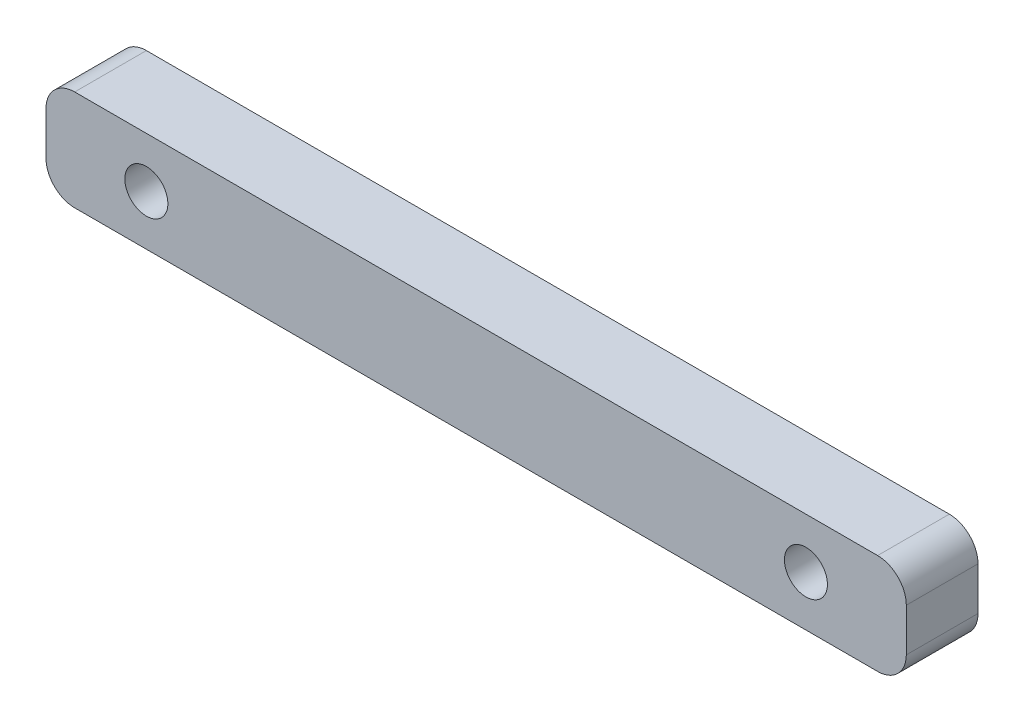
ISO-10303-21;
HEADER;
FILE_DESCRIPTION(('STEP AP214'),'2;1');
FILE_NAME('part.step','',(''),(''),'','','');
FILE_SCHEMA(('AUTOMOTIVE_DESIGN { 1 0 10303 214 1 1 1 1 }'));
ENDSEC;
DATA;
#1=APPLICATION_CONTEXT('core data for automotive mechanical design processes');
#2=APPLICATION_PROTOCOL_DEFINITION('international standard','automotive_design',2000,#1);
#3=PRODUCT_CONTEXT('',#1,'mechanical');
#4=PRODUCT('Part','Part','',(#3));
#5=PRODUCT_RELATED_PRODUCT_CATEGORY('part','',(#4));
#6=PRODUCT_DEFINITION_FORMATION('','',#4);
#7=PRODUCT_DEFINITION_CONTEXT('part definition',#1,'design');
#8=PRODUCT_DEFINITION('design','',#6,#7);
#9=PRODUCT_DEFINITION_SHAPE('','',#8);
#10=(LENGTH_UNIT() NAMED_UNIT(*) SI_UNIT(.MILLI.,.METRE.));
#11=(NAMED_UNIT(*) PLANE_ANGLE_UNIT() SI_UNIT($,.RADIAN.));
#12=(NAMED_UNIT(*) SI_UNIT($,.STERADIAN.) SOLID_ANGLE_UNIT());
#13=UNCERTAINTY_MEASURE_WITH_UNIT(LENGTH_MEASURE(1.E-05),#10,'distance_accuracy_value','');
#14=(GEOMETRIC_REPRESENTATION_CONTEXT(3) GLOBAL_UNCERTAINTY_ASSIGNED_CONTEXT((#13)) GLOBAL_UNIT_ASSIGNED_CONTEXT((#10,
#11,#12)) REPRESENTATION_CONTEXT('',''));
#15=CARTESIAN_POINT('',(0.,0.,0.));
#16=DIRECTION('',(0.,0.,1.));
#17=DIRECTION('',(1.,0.,0.));
#18=AXIS2_PLACEMENT_3D('',#15,#16,#17);
#19=CARTESIAN_POINT('',(0.,0.,5.));
#20=DIRECTION('',(0.,0.,-1.));
#21=DIRECTION('',(-1.,0.,0.));
#22=AXIS2_PLACEMENT_3D('',#19,#20,#21);
#23=PLANE('',#22);
#24=DIRECTION('',(0.,1.,0.));
#25=VECTOR('',#24,1.);
#26=CARTESIAN_POINT('',(30.,-3.5,5.));
#27=LINE('',#26,#25);
#28=CARTESIAN_POINT('',(30.,-1.5,5.));
#29=VERTEX_POINT('',#28);
#30=CARTESIAN_POINT('',(30.,1.5,5.));
#31=VERTEX_POINT('',#30);
#32=EDGE_CURVE('E145',#29,#31,#27,.T.);
#33=ORIENTED_EDGE('',*,*,#32,.T.);
#34=CARTESIAN_POINT('',(28.,1.5,5.));
#35=DIRECTION('',(0.,0.,-1.));
#36=DIRECTION('',(-1.,0.,0.));
#37=AXIS2_PLACEMENT_3D('',#34,#35,#36);
#38=CIRCLE('',#37,2.);
#39=CARTESIAN_POINT('',(28.,3.5,5.));
#40=VERTEX_POINT('',#39);
#41=EDGE_CURVE('E159',#31,#40,#38,.F.);
#42=ORIENTED_EDGE('',*,*,#41,.T.);
#43=DIRECTION('',(-1.,0.,0.));
#44=VECTOR('',#43,1.);
#45=CARTESIAN_POINT('',(-30.,3.5,5.));
#46=LINE('',#45,#44);
#47=CARTESIAN_POINT('',(-28.,3.5,5.));
#48=VERTEX_POINT('',#47);
#49=EDGE_CURVE('E126',#40,#48,#46,.T.);
#50=ORIENTED_EDGE('',*,*,#49,.T.);
#51=CARTESIAN_POINT('',(-28.,1.5,5.));
#52=DIRECTION('',(0.,0.,-1.));
#53=DIRECTION('',(-1.,0.,0.));
#54=AXIS2_PLACEMENT_3D('',#51,#52,#53);
#55=CIRCLE('',#54,2.);
#56=CARTESIAN_POINT('',(-30.,1.5,5.));
#57=VERTEX_POINT('',#56);
#58=EDGE_CURVE('E155',#48,#57,#55,.F.);
#59=ORIENTED_EDGE('',*,*,#58,.T.);
#60=DIRECTION('',(0.,-1.,0.));
#61=VECTOR('',#60,1.);
#62=CARTESIAN_POINT('',(-30.,-3.5,5.));
#63=LINE('',#62,#61);
#64=CARTESIAN_POINT('',(-30.,-1.5,5.));
#65=VERTEX_POINT('',#64);
#66=EDGE_CURVE('E168',#57,#65,#63,.T.);
#67=ORIENTED_EDGE('',*,*,#66,.T.);
#68=CARTESIAN_POINT('',(-28.,-1.5,5.));
#69=DIRECTION('',(0.,0.,-1.));
#70=DIRECTION('',(-1.,0.,0.));
#71=AXIS2_PLACEMENT_3D('',#68,#69,#70);
#72=CIRCLE('',#71,2.);
#73=CARTESIAN_POINT('',(-28.,-3.5,5.));
#74=VERTEX_POINT('',#73);
#75=EDGE_CURVE('E61',#65,#74,#72,.F.);
#76=ORIENTED_EDGE('',*,*,#75,.T.);
#77=DIRECTION('',(1.,0.,0.));
#78=VECTOR('',#77,1.);
#79=CARTESIAN_POINT('',(-30.,-3.5,5.));
#80=LINE('',#79,#78);
#81=CARTESIAN_POINT('',(28.,-3.5,5.));
#82=VERTEX_POINT('',#81);
#83=EDGE_CURVE('E146',#74,#82,#80,.T.);
#84=ORIENTED_EDGE('',*,*,#83,.T.);
#85=CARTESIAN_POINT('',(28.,-1.5,5.));
#86=DIRECTION('',(0.,0.,-1.));
#87=DIRECTION('',(-1.,0.,0.));
#88=AXIS2_PLACEMENT_3D('',#85,#86,#87);
#89=CIRCLE('',#88,2.);
#90=EDGE_CURVE('E157',#82,#29,#89,.F.);
#91=ORIENTED_EDGE('',*,*,#90,.T.);
#92=EDGE_LOOP('',(#33,#42,#50,#59,#67,#76,#84,#91));
#93=FACE_BOUND('',#92,.T.);
#94=CARTESIAN_POINT('',(-23.,0.,5.));
#95=DIRECTION('',(0.,0.,1.));
#96=DIRECTION('',(1.,0.,0.));
#97=AXIS2_PLACEMENT_3D('',#94,#95,#96);
#98=CIRCLE('',#97,1.5);
#99=CARTESIAN_POINT('',(-21.5,0.,5.));
#100=VERTEX_POINT('',#99);
#101=EDGE_CURVE('E140',#100,#100,#98,.T.);
#102=ORIENTED_EDGE('',*,*,#101,.F.);
#103=EDGE_LOOP('',(#102));
#104=FACE_BOUND('',#103,.T.);
#105=CARTESIAN_POINT('',(23.,0.,5.));
#106=DIRECTION('',(0.,0.,1.));
#107=DIRECTION('',(-1.,0.,0.));
#108=AXIS2_PLACEMENT_3D('',#105,#106,#107);
#109=CIRCLE('',#108,1.5);
#110=CARTESIAN_POINT('',(21.5,0.,5.));
#111=VERTEX_POINT('',#110);
#112=EDGE_CURVE('E191',#111,#111,#109,.T.);
#113=ORIENTED_EDGE('',*,*,#112,.F.);
#114=EDGE_LOOP('',(#113));
#115=FACE_BOUND('',#114,.T.);
#116=ADVANCED_FACE('F39',(#93,#104,#115),#23,.F.);
#117=CARTESIAN_POINT('',(0.,0.,0.));
#118=DIRECTION('',(0.,0.,-1.));
#119=DIRECTION('',(-1.,0.,0.));
#120=AXIS2_PLACEMENT_3D('',#117,#118,#119);
#121=PLANE('',#120);
#122=CARTESIAN_POINT('',(-23.,0.,0.));
#123=DIRECTION('',(0.,0.,1.));
#124=DIRECTION('',(1.,0.,0.));
#125=AXIS2_PLACEMENT_3D('',#122,#123,#124);
#126=CIRCLE('',#125,1.5);
#127=CARTESIAN_POINT('',(-21.5,0.,0.));
#128=VERTEX_POINT('',#127);
#129=EDGE_CURVE('E188',#128,#128,#126,.T.);
#130=ORIENTED_EDGE('',*,*,#129,.T.);
#131=EDGE_LOOP('',(#130));
#132=FACE_BOUND('',#131,.T.);
#133=DIRECTION('',(-1.,0.,0.));
#134=VECTOR('',#133,1.);
#135=CARTESIAN_POINT('',(-30.,3.5,0.));
#136=LINE('',#135,#134);
#137=CARTESIAN_POINT('',(28.,3.5,0.));
#138=VERTEX_POINT('',#137);
#139=CARTESIAN_POINT('',(-28.,3.5,0.));
#140=VERTEX_POINT('',#139);
#141=EDGE_CURVE('E123',#138,#140,#136,.T.);
#142=ORIENTED_EDGE('',*,*,#141,.F.);
#143=CARTESIAN_POINT('',(28.,1.5,0.));
#144=DIRECTION('',(0.,0.,-1.));
#145=DIRECTION('',(-1.,0.,0.));
#146=AXIS2_PLACEMENT_3D('',#143,#144,#145);
#147=CIRCLE('',#146,2.);
#148=CARTESIAN_POINT('',(30.,1.5,0.));
#149=VERTEX_POINT('',#148);
#150=EDGE_CURVE('E106',#138,#149,#147,.T.);
#151=ORIENTED_EDGE('',*,*,#150,.T.);
#152=DIRECTION('',(0.,1.,0.));
#153=VECTOR('',#152,1.);
#154=CARTESIAN_POINT('',(30.,-3.5,0.));
#155=LINE('',#154,#153);
#156=CARTESIAN_POINT('',(30.,-1.5,0.));
#157=VERTEX_POINT('',#156);
#158=EDGE_CURVE('E135',#157,#149,#155,.T.);
#159=ORIENTED_EDGE('',*,*,#158,.F.);
#160=CARTESIAN_POINT('',(28.,-1.5,0.));
#161=DIRECTION('',(0.,0.,-1.));
#162=DIRECTION('',(-1.,0.,0.));
#163=AXIS2_PLACEMENT_3D('',#160,#161,#162);
#164=CIRCLE('',#163,2.);
#165=CARTESIAN_POINT('',(28.,-3.5,0.));
#166=VERTEX_POINT('',#165);
#167=EDGE_CURVE('E117',#157,#166,#164,.T.);
#168=ORIENTED_EDGE('',*,*,#167,.T.);
#169=DIRECTION('',(1.,0.,0.));
#170=VECTOR('',#169,1.);
#171=CARTESIAN_POINT('',(-30.,-3.5,0.));
#172=LINE('',#171,#170);
#173=CARTESIAN_POINT('',(-28.,-3.5,0.));
#174=VERTEX_POINT('',#173);
#175=EDGE_CURVE('E138',#174,#166,#172,.T.);
#176=ORIENTED_EDGE('',*,*,#175,.F.);
#177=CARTESIAN_POINT('',(-28.,-1.5,0.));
#178=DIRECTION('',(0.,0.,-1.));
#179=DIRECTION('',(-1.,0.,0.));
#180=AXIS2_PLACEMENT_3D('',#177,#178,#179);
#181=CIRCLE('',#180,2.);
#182=CARTESIAN_POINT('',(-30.,-1.5,0.));
#183=VERTEX_POINT('',#182);
#184=EDGE_CURVE('E127',#174,#183,#181,.T.);
#185=ORIENTED_EDGE('',*,*,#184,.T.);
#186=DIRECTION('',(0.,-1.,0.));
#187=VECTOR('',#186,1.);
#188=CARTESIAN_POINT('',(-30.,-3.5,0.));
#189=LINE('',#188,#187);
#190=CARTESIAN_POINT('',(-30.,1.5,0.));
#191=VERTEX_POINT('',#190);
#192=EDGE_CURVE('E134',#191,#183,#189,.T.);
#193=ORIENTED_EDGE('',*,*,#192,.F.);
#194=CARTESIAN_POINT('',(-28.,1.5,0.));
#195=DIRECTION('',(0.,0.,-1.));
#196=DIRECTION('',(-1.,0.,0.));
#197=AXIS2_PLACEMENT_3D('',#194,#195,#196);
#198=CIRCLE('',#197,2.);
#199=EDGE_CURVE('E133',#191,#140,#198,.T.);
#200=ORIENTED_EDGE('',*,*,#199,.T.);
#201=EDGE_LOOP('',(#142,#151,#159,#168,#176,#185,#193,#200));
#202=FACE_BOUND('',#201,.T.);
#203=CARTESIAN_POINT('',(23.,0.,0.));
#204=DIRECTION('',(0.,0.,1.));
#205=DIRECTION('',(-1.,0.,0.));
#206=AXIS2_PLACEMENT_3D('',#203,#204,#205);
#207=CIRCLE('',#206,1.5);
#208=CARTESIAN_POINT('',(21.5,0.,0.));
#209=VERTEX_POINT('',#208);
#210=EDGE_CURVE('E194',#209,#209,#207,.T.);
#211=ORIENTED_EDGE('',*,*,#210,.T.);
#212=EDGE_LOOP('',(#211));
#213=FACE_BOUND('',#212,.T.);
#214=ADVANCED_FACE('F130',(#132,#202,#213),#121,.T.);
#215=CARTESIAN_POINT('',(30.,-3.5,5.));
#216=DIRECTION('',(-1.,0.,0.));
#217=DIRECTION('',(0.,0.,1.));
#218=AXIS2_PLACEMENT_3D('',#215,#216,#217);
#219=PLANE('',#218);
#220=ORIENTED_EDGE('',*,*,#158,.T.);
#221=DIRECTION('',(0.,0.,-1.));
#222=VECTOR('',#221,1.);
#223=CARTESIAN_POINT('',(30.,1.5,5.));
#224=LINE('',#223,#222);
#225=EDGE_CURVE('E111',#149,#31,#224,.F.);
#226=ORIENTED_EDGE('',*,*,#225,.T.);
#227=ORIENTED_EDGE('',*,*,#32,.F.);
#228=DIRECTION('',(0.,0.,-1.));
#229=VECTOR('',#228,1.);
#230=CARTESIAN_POINT('',(30.,-1.5,5.));
#231=LINE('',#230,#229);
#232=EDGE_CURVE('E116',#29,#157,#231,.T.);
#233=ORIENTED_EDGE('',*,*,#232,.T.);
#234=EDGE_LOOP('',(#220,#226,#227,#233));
#235=FACE_BOUND('',#234,.T.);
#236=ADVANCED_FACE('F184',(#235),#219,.F.);
#237=CARTESIAN_POINT('',(-30.,3.5,5.));
#238=DIRECTION('',(0.,-1.,0.));
#239=DIRECTION('',(0.,0.,-1.));
#240=AXIS2_PLACEMENT_3D('',#237,#238,#239);
#241=PLANE('',#240);
#242=ORIENTED_EDGE('',*,*,#49,.F.);
#243=DIRECTION('',(0.,0.,-1.));
#244=VECTOR('',#243,1.);
#245=CARTESIAN_POINT('',(28.,3.5,5.));
#246=LINE('',#245,#244);
#247=EDGE_CURVE('E110',#40,#138,#246,.T.);
#248=ORIENTED_EDGE('',*,*,#247,.T.);
#249=ORIENTED_EDGE('',*,*,#141,.T.);
#250=DIRECTION('',(0.,0.,-1.));
#251=VECTOR('',#250,1.);
#252=CARTESIAN_POINT('',(-28.,3.5,5.));
#253=LINE('',#252,#251);
#254=EDGE_CURVE('E128',#140,#48,#253,.F.);
#255=ORIENTED_EDGE('',*,*,#254,.T.);
#256=EDGE_LOOP('',(#242,#248,#249,#255));
#257=FACE_BOUND('',#256,.T.);
#258=ADVANCED_FACE('F122',(#257),#241,.F.);
#259=CARTESIAN_POINT('',(-30.,-3.5,5.));
#260=DIRECTION('',(1.,0.,0.));
#261=DIRECTION('',(0.,0.,-1.));
#262=AXIS2_PLACEMENT_3D('',#259,#260,#261);
#263=PLANE('',#262);
#264=ORIENTED_EDGE('',*,*,#66,.F.);
#265=DIRECTION('',(0.,0.,-1.));
#266=VECTOR('',#265,1.);
#267=CARTESIAN_POINT('',(-30.,1.5,5.));
#268=LINE('',#267,#266);
#269=EDGE_CURVE('E11',#57,#191,#268,.T.);
#270=ORIENTED_EDGE('',*,*,#269,.T.);
#271=ORIENTED_EDGE('',*,*,#192,.T.);
#272=DIRECTION('',(0.,0.,-1.));
#273=VECTOR('',#272,1.);
#274=CARTESIAN_POINT('',(-30.,-1.5,5.));
#275=LINE('',#274,#273);
#276=EDGE_CURVE('E47',#183,#65,#275,.F.);
#277=ORIENTED_EDGE('',*,*,#276,.T.);
#278=EDGE_LOOP('',(#264,#270,#271,#277));
#279=FACE_BOUND('',#278,.T.);
#280=ADVANCED_FACE('F167',(#279),#263,.F.);
#281=CARTESIAN_POINT('',(-30.,-3.5,5.));
#282=DIRECTION('',(0.,1.,0.));
#283=DIRECTION('',(0.,0.,1.));
#284=AXIS2_PLACEMENT_3D('',#281,#282,#283);
#285=PLANE('',#284);
#286=ORIENTED_EDGE('',*,*,#175,.T.);
#287=DIRECTION('',(0.,0.,-1.));
#288=VECTOR('',#287,1.);
#289=CARTESIAN_POINT('',(28.,-3.5,5.));
#290=LINE('',#289,#288);
#291=EDGE_CURVE('E54',#166,#82,#290,.F.);
#292=ORIENTED_EDGE('',*,*,#291,.T.);
#293=ORIENTED_EDGE('',*,*,#83,.F.);
#294=DIRECTION('',(0.,0.,-1.));
#295=VECTOR('',#294,1.);
#296=CARTESIAN_POINT('',(-28.,-3.5,5.));
#297=LINE('',#296,#295);
#298=EDGE_CURVE('E161',#74,#174,#297,.T.);
#299=ORIENTED_EDGE('',*,*,#298,.T.);
#300=EDGE_LOOP('',(#286,#292,#293,#299));
#301=FACE_BOUND('',#300,.T.);
#302=ADVANCED_FACE('F177',(#301),#285,.F.);
#303=CARTESIAN_POINT('',(-23.,0.,5.));
#304=DIRECTION('',(0.,0.,-1.));
#305=DIRECTION('',(-1.,0.,0.));
#306=AXIS2_PLACEMENT_3D('',#303,#304,#305);
#307=CYLINDRICAL_SURFACE('',#306,1.5);
#308=ORIENTED_EDGE('',*,*,#101,.T.);
#309=EDGE_LOOP('',(#308));
#310=FACE_BOUND('',#309,.T.);
#311=ORIENTED_EDGE('',*,*,#129,.F.);
#312=EDGE_LOOP('',(#311));
#313=FACE_BOUND('',#312,.T.);
#314=ADVANCED_FACE('F212',(#310,#313),#307,.F.);
#315=CARTESIAN_POINT('',(23.,0.,5.));
#316=DIRECTION('',(0.,0.,-1.));
#317=DIRECTION('',(-1.,0.,0.));
#318=AXIS2_PLACEMENT_3D('',#315,#316,#317);
#319=CYLINDRICAL_SURFACE('',#318,1.5);
#320=ORIENTED_EDGE('',*,*,#112,.T.);
#321=EDGE_LOOP('',(#320));
#322=FACE_BOUND('',#321,.T.);
#323=ORIENTED_EDGE('',*,*,#210,.F.);
#324=EDGE_LOOP('',(#323));
#325=FACE_BOUND('',#324,.T.);
#326=ADVANCED_FACE('F200',(#322,#325),#319,.F.);
#327=CARTESIAN_POINT('',(28.,1.5,5.));
#328=DIRECTION('',(0.,0.,-1.));
#329=DIRECTION('',(-1.,0.,0.));
#330=AXIS2_PLACEMENT_3D('',#327,#328,#329);
#331=CYLINDRICAL_SURFACE('',#330,2.);
#332=ORIENTED_EDGE('',*,*,#41,.F.);
#333=ORIENTED_EDGE('',*,*,#225,.F.);
#334=ORIENTED_EDGE('',*,*,#150,.F.);
#335=ORIENTED_EDGE('',*,*,#247,.F.);
#336=EDGE_LOOP('',(#332,#333,#334,#335));
#337=FACE_BOUND('',#336,.T.);
#338=ADVANCED_FACE('F109',(#337),#331,.T.);
#339=CARTESIAN_POINT('',(28.,-1.5,5.));
#340=DIRECTION('',(0.,0.,-1.));
#341=DIRECTION('',(-1.,0.,0.));
#342=AXIS2_PLACEMENT_3D('',#339,#340,#341);
#343=CYLINDRICAL_SURFACE('',#342,2.);
#344=ORIENTED_EDGE('',*,*,#90,.F.);
#345=ORIENTED_EDGE('',*,*,#291,.F.);
#346=ORIENTED_EDGE('',*,*,#167,.F.);
#347=ORIENTED_EDGE('',*,*,#232,.F.);
#348=EDGE_LOOP('',(#344,#345,#346,#347));
#349=FACE_BOUND('',#348,.T.);
#350=ADVANCED_FACE('F181',(#349),#343,.T.);
#351=CARTESIAN_POINT('',(-28.,1.5,5.));
#352=DIRECTION('',(0.,0.,-1.));
#353=DIRECTION('',(-1.,0.,0.));
#354=AXIS2_PLACEMENT_3D('',#351,#352,#353);
#355=CYLINDRICAL_SURFACE('',#354,2.);
#356=ORIENTED_EDGE('',*,*,#58,.F.);
#357=ORIENTED_EDGE('',*,*,#254,.F.);
#358=ORIENTED_EDGE('',*,*,#199,.F.);
#359=ORIENTED_EDGE('',*,*,#269,.F.);
#360=EDGE_LOOP('',(#356,#357,#358,#359));
#361=FACE_BOUND('',#360,.T.);
#362=ADVANCED_FACE('F226',(#361),#355,.T.);
#363=CARTESIAN_POINT('',(-28.,-1.5,5.));
#364=DIRECTION('',(0.,0.,-1.));
#365=DIRECTION('',(-1.,0.,0.));
#366=AXIS2_PLACEMENT_3D('',#363,#364,#365);
#367=CYLINDRICAL_SURFACE('',#366,2.);
#368=ORIENTED_EDGE('',*,*,#75,.F.);
#369=ORIENTED_EDGE('',*,*,#276,.F.);
#370=ORIENTED_EDGE('',*,*,#184,.F.);
#371=ORIENTED_EDGE('',*,*,#298,.F.);
#372=EDGE_LOOP('',(#368,#369,#370,#371));
#373=FACE_BOUND('',#372,.T.);
#374=ADVANCED_FACE('F41',(#373),#367,.T.);
#375=CLOSED_SHELL('',(#116,#214,#236,#258,#280,#302,#314,#326,#338,#350,#362,#374));
#376=MANIFOLD_SOLID_BREP('B2',#375);
#377=ADVANCED_BREP_SHAPE_REPRESENTATION('',(#18,#376),#14);
#378=SHAPE_DEFINITION_REPRESENTATION(#9,#377);
ENDSEC;
END-ISO-10303-21;
